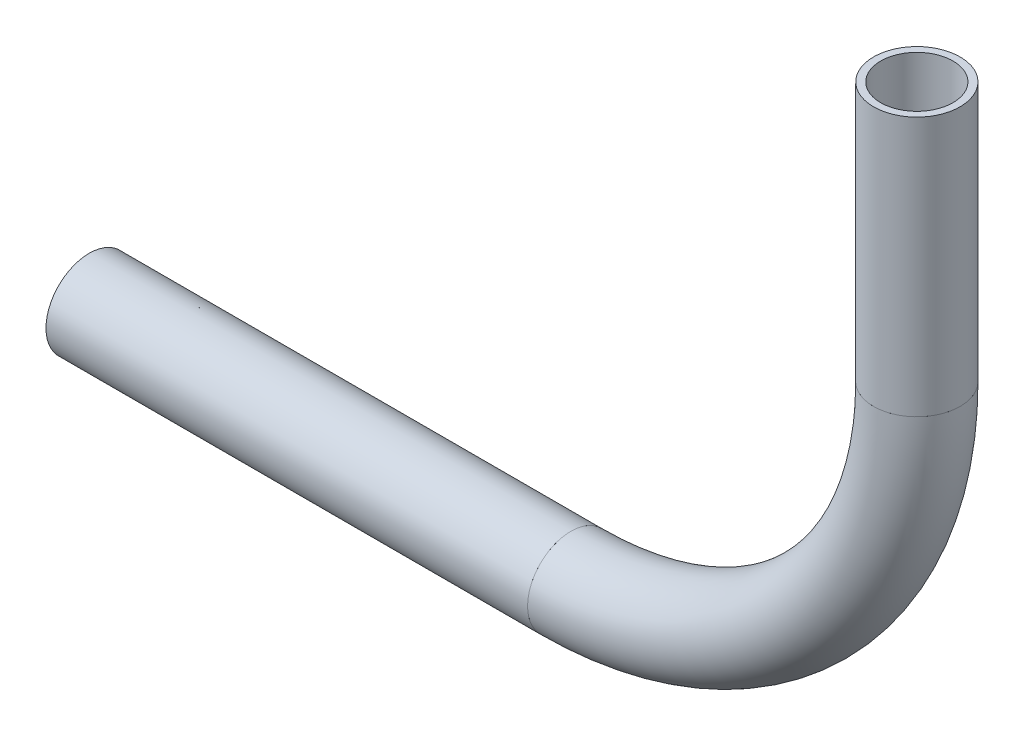
ISO-10303-21;
HEADER;
FILE_DESCRIPTION(('STEP AP214'),'2;1');
FILE_NAME('part.step','',(''),(''),'','','');
FILE_SCHEMA(('AUTOMOTIVE_DESIGN { 1 0 10303 214 1 1 1 1 }'));
ENDSEC;
DATA;
#1=APPLICATION_CONTEXT('core data for automotive mechanical design processes');
#2=APPLICATION_PROTOCOL_DEFINITION('international standard','automotive_design',2000,#1);
#3=PRODUCT_CONTEXT('',#1,'mechanical');
#4=PRODUCT('Part','Part','',(#3));
#5=PRODUCT_RELATED_PRODUCT_CATEGORY('part','',(#4));
#6=PRODUCT_DEFINITION_FORMATION('','',#4);
#7=PRODUCT_DEFINITION_CONTEXT('part definition',#1,'design');
#8=PRODUCT_DEFINITION('design','',#6,#7);
#9=PRODUCT_DEFINITION_SHAPE('','',#8);
#10=(LENGTH_UNIT() NAMED_UNIT(*) SI_UNIT(.MILLI.,.METRE.));
#11=(NAMED_UNIT(*) PLANE_ANGLE_UNIT() SI_UNIT($,.RADIAN.));
#12=(NAMED_UNIT(*) SI_UNIT($,.STERADIAN.) SOLID_ANGLE_UNIT());
#13=UNCERTAINTY_MEASURE_WITH_UNIT(LENGTH_MEASURE(1.E-05),#10,'distance_accuracy_value','');
#14=(GEOMETRIC_REPRESENTATION_CONTEXT(3) GLOBAL_UNCERTAINTY_ASSIGNED_CONTEXT((#13)) GLOBAL_UNIT_ASSIGNED_CONTEXT((#10,
#11,#12)) REPRESENTATION_CONTEXT('',''));
#15=CARTESIAN_POINT('',(0.,0.,0.));
#16=DIRECTION('',(0.,0.,1.));
#17=DIRECTION('',(1.,0.,0.));
#18=AXIS2_PLACEMENT_3D('',#15,#16,#17);
#19=CARTESIAN_POINT('',(-669.026852298777,-826.742936830069,0.));
#20=DIRECTION('',(0.,1.,0.));
#21=DIRECTION('',(0.,0.,1.));
#22=AXIS2_PLACEMENT_3D('',#19,#20,#21);
#23=CYLINDRICAL_SURFACE('',#22,5.30859999999999);
#24=CARTESIAN_POINT('',(-669.026852298777,-788.64293683007,0.));
#25=DIRECTION('',(0.,-1.,0.));
#26=DIRECTION('',(1.,0.,0.));
#27=AXIS2_PLACEMENT_3D('',#24,#25,#26);
#28=CIRCLE('',#27,5.30859999999999);
#29=CARTESIAN_POINT('',(-669.026852298777,-788.64293683007,5.30859999999999));
#30=VERTEX_POINT('',#29);
#31=EDGE_CURVE('E57',#30,#30,#28,.T.);
#32=CARTESIAN_POINT('',(-669.026852298777,-826.742936830069,0.));
#33=DIRECTION('',(0.,-1.,0.));
#34=DIRECTION('',(1.,0.,0.));
#35=AXIS2_PLACEMENT_3D('',#32,#33,#34);
#36=CIRCLE('',#35,5.30859999999999);
#37=CARTESIAN_POINT('',(-669.026852298777,-826.742936830069,5.30859999999999));
#38=VERTEX_POINT('',#37);
#39=EDGE_CURVE('E53',#38,#38,#36,.T.);
#40=CARTESIAN_POINT('',(-669.026852298777,-788.64293683007,5.30859999999999));
#41=CARTESIAN_POINT('',(-669.026852298777,-789.039811830069,5.30859999999999));
#42=CARTESIAN_POINT('',(-669.026852298777,-789.436686830069,5.30859999999999));
#43=CARTESIAN_POINT('',(-669.026852298777,-790.230436830069,5.30859999999999));
#44=CARTESIAN_POINT('',(-669.026852298777,-790.627311830069,5.30859999999999));
#45=CARTESIAN_POINT('',(-669.026852298777,-791.421061830069,5.30859999999999));
#46=CARTESIAN_POINT('',(-669.026852298777,-791.817936830069,5.30859999999999));
#47=CARTESIAN_POINT('',(-669.026852298777,-792.611686830069,5.30859999999999));
#48=CARTESIAN_POINT('',(-669.026852298777,-793.008561830069,5.30859999999999));
#49=CARTESIAN_POINT('',(-669.026852298777,-793.802311830069,5.30859999999999));
#50=CARTESIAN_POINT('',(-669.026852298777,-794.199186830069,5.30859999999999));
#51=CARTESIAN_POINT('',(-669.026852298777,-794.992936830069,5.30859999999999));
#52=CARTESIAN_POINT('',(-669.026852298777,-795.389811830069,5.30859999999999));
#53=CARTESIAN_POINT('',(-669.026852298777,-796.183561830069,5.30859999999999));
#54=CARTESIAN_POINT('',(-669.026852298777,-796.580436830069,5.30859999999999));
#55=CARTESIAN_POINT('',(-669.026852298777,-797.374186830069,5.30859999999999));
#56=CARTESIAN_POINT('',(-669.026852298777,-797.771061830069,5.30859999999999));
#57=CARTESIAN_POINT('',(-669.026852298777,-798.564811830069,5.30859999999999));
#58=CARTESIAN_POINT('',(-669.026852298777,-798.961686830069,5.30859999999999));
#59=CARTESIAN_POINT('',(-669.026852298777,-799.755436830069,5.30859999999999));
#60=CARTESIAN_POINT('',(-669.026852298777,-800.152311830069,5.30859999999999));
#61=CARTESIAN_POINT('',(-669.026852298777,-800.946061830069,5.30859999999999));
#62=CARTESIAN_POINT('',(-669.026852298777,-801.342936830069,5.30859999999999));
#63=CARTESIAN_POINT('',(-669.026852298777,-802.136686830069,5.30859999999999));
#64=CARTESIAN_POINT('',(-669.026852298777,-802.533561830069,5.30859999999999));
#65=CARTESIAN_POINT('',(-669.026852298777,-803.327311830069,5.30859999999999));
#66=CARTESIAN_POINT('',(-669.026852298777,-803.724186830069,5.30859999999999));
#67=CARTESIAN_POINT('',(-669.026852298777,-804.517936830069,5.30859999999999));
#68=CARTESIAN_POINT('',(-669.026852298777,-804.914811830069,5.30859999999999));
#69=CARTESIAN_POINT('',(-669.026852298777,-805.708561830069,5.30859999999999));
#70=CARTESIAN_POINT('',(-669.026852298777,-806.105436830069,5.30859999999999));
#71=CARTESIAN_POINT('',(-669.026852298777,-806.899186830069,5.30859999999999));
#72=CARTESIAN_POINT('',(-669.026852298777,-807.296061830069,5.30859999999999));
#73=CARTESIAN_POINT('',(-669.026852298777,-808.089811830069,5.30859999999999));
#74=CARTESIAN_POINT('',(-669.026852298777,-808.486686830069,5.30859999999999));
#75=CARTESIAN_POINT('',(-669.026852298777,-809.280436830069,5.30859999999999));
#76=CARTESIAN_POINT('',(-669.026852298777,-809.677311830069,5.30859999999999));
#77=CARTESIAN_POINT('',(-669.026852298777,-810.471061830069,5.30859999999999));
#78=CARTESIAN_POINT('',(-669.026852298777,-810.867936830069,5.30859999999999));
#79=CARTESIAN_POINT('',(-669.026852298777,-811.661686830069,5.30859999999999));
#80=CARTESIAN_POINT('',(-669.026852298777,-812.058561830069,5.30859999999999));
#81=CARTESIAN_POINT('',(-669.026852298777,-812.852311830069,5.30859999999999));
#82=CARTESIAN_POINT('',(-669.026852298777,-813.249186830069,5.30859999999999));
#83=CARTESIAN_POINT('',(-669.026852298777,-814.042936830069,5.30859999999999));
#84=CARTESIAN_POINT('',(-669.026852298777,-814.439811830069,5.30859999999999));
#85=CARTESIAN_POINT('',(-669.026852298777,-815.233561830069,5.30859999999999));
#86=CARTESIAN_POINT('',(-669.026852298777,-815.630436830069,5.30859999999999));
#87=CARTESIAN_POINT('',(-669.026852298777,-816.424186830069,5.30859999999999));
#88=CARTESIAN_POINT('',(-669.026852298777,-816.821061830069,5.30859999999999));
#89=CARTESIAN_POINT('',(-669.026852298777,-817.614811830069,5.30859999999999));
#90=CARTESIAN_POINT('',(-669.026852298777,-818.011686830069,5.30859999999999));
#91=CARTESIAN_POINT('',(-669.026852298777,-818.805436830069,5.30859999999999));
#92=CARTESIAN_POINT('',(-669.026852298777,-819.202311830069,5.30859999999999));
#93=CARTESIAN_POINT('',(-669.026852298777,-819.996061830069,5.30859999999999));
#94=CARTESIAN_POINT('',(-669.026852298777,-820.392936830069,5.30859999999999));
#95=CARTESIAN_POINT('',(-669.026852298777,-821.186686830069,5.30859999999999));
#96=CARTESIAN_POINT('',(-669.026852298777,-821.583561830069,5.30859999999999));
#97=CARTESIAN_POINT('',(-669.026852298777,-822.377311830069,5.30859999999999));
#98=CARTESIAN_POINT('',(-669.026852298777,-822.774186830069,5.30859999999999));
#99=CARTESIAN_POINT('',(-669.026852298777,-823.567936830069,5.30859999999999));
#100=CARTESIAN_POINT('',(-669.026852298777,-823.964811830069,5.30859999999999));
#101=CARTESIAN_POINT('',(-669.026852298777,-824.758561830069,5.30859999999999));
#102=CARTESIAN_POINT('',(-669.026852298777,-825.155436830069,5.30859999999999));
#103=CARTESIAN_POINT('',(-669.026852298777,-825.949186830069,5.30859999999999));
#104=CARTESIAN_POINT('',(-669.026852298777,-826.346061830069,5.30859999999999));
#105=CARTESIAN_POINT('',(-669.026852298777,-826.742936830069,5.30859999999999));
#106=B_SPLINE_CURVE_WITH_KNOTS('',3,(#40,#41,#42,#43,#44,#45,#46,#47,#48,#49,#50,#51,#52,#53,
#54,#55,#56,#57,#58,#59,#60,#61,#62,#63,#64,#65,#66,#67,#68,#69,#70,#71,#72,#73,#74,#75,#76,#77,
#78,#79,#80,#81,#82,#83,#84,#85,#86,#87,#88,#89,#90,#91,#92,#93,#94,#95,#96,#97,#98,#99,#100,
#101,#102,#103,#104,#105),.UNSPECIFIED.,.F.,.F.,(4,2,2,2,2,2,2,2,2,2,2,2,2,2,2,2,2,2,2,2,2,2,2,
2,2,2,2,2,2,2,2,2,4),(0.,1.19062499999989,2.38124999999989,3.57187499999989,4.76249999999989,
5.95312499999989,7.14374999999989,8.33437499999989,9.5249999999999,10.7156249999998,
11.9062499999998,13.0968749999998,14.2874999999998,15.4781249999998,16.6687499999998,
17.8593749999998,19.0499999999998,20.2406249999997,21.4312499999997,22.6218749999997,
23.8124999999997,25.0031249999997,26.1937499999997,27.3843749999997,28.5749999999997,
29.7656249999996,30.9562499999996,32.1468749999996,33.3374999999996,34.5281249999996,
35.7187499999996,36.9093749999996,38.0999999999996),.UNSPECIFIED.);
#107=EDGE_CURVE('BSEAM49',#30,#38,#106,.T.);
#108=ORIENTED_EDGE('',*,*,#31,.F.);
#109=ORIENTED_EDGE('',*,*,#39,.T.);
#110=ORIENTED_EDGE('',*,*,#107,.T.);
#111=ORIENTED_EDGE('',*,*,#107,.F.);
#112=EDGE_LOOP('',(#108,#110,#109,#111));
#113=FACE_BOUND('',#112,.T.);
#114=ADVANCED_FACE('F49',(#113),#23,.F.);
#115=CARTESIAN_POINT('',(-669.026852298777,-826.742936830069,0.));
#116=DIRECTION('',(0.,1.,0.));
#117=DIRECTION('',(0.,0.,1.));
#118=AXIS2_PLACEMENT_3D('',#115,#116,#117);
#119=CYLINDRICAL_SURFACE('',#118,6.35000000000005);
#120=CARTESIAN_POINT('',(-669.026852298777,-788.64293683007,0.));
#121=DIRECTION('',(0.,-1.,0.));
#122=DIRECTION('',(1.,0.,0.));
#123=AXIS2_PLACEMENT_3D('',#120,#121,#122);
#124=CIRCLE('',#123,6.35000000000005);
#125=CARTESIAN_POINT('',(-669.026852298777,-788.64293683007,6.35000000000005));
#126=VERTEX_POINT('',#125);
#127=EDGE_CURVE('E61',#126,#126,#124,.T.);
#128=CARTESIAN_POINT('',(-669.026852298777,-826.742936830069,0.));
#129=DIRECTION('',(0.,-1.,0.));
#130=DIRECTION('',(1.,0.,0.));
#131=AXIS2_PLACEMENT_3D('',#128,#129,#130);
#132=CIRCLE('',#131,6.35000000000005);
#133=CARTESIAN_POINT('',(-669.026852298777,-826.742936830069,6.35000000000005));
#134=VERTEX_POINT('',#133);
#135=EDGE_CURVE('E12',#134,#134,#132,.T.);
#136=CARTESIAN_POINT('',(-669.026852298777,-788.64293683007,6.35000000000005));
#137=CARTESIAN_POINT('',(-669.026852298777,-789.039811830069,6.35000000000005));
#138=CARTESIAN_POINT('',(-669.026852298777,-789.436686830069,6.35000000000005));
#139=CARTESIAN_POINT('',(-669.026852298777,-790.230436830069,6.35000000000005));
#140=CARTESIAN_POINT('',(-669.026852298777,-790.627311830069,6.35000000000005));
#141=CARTESIAN_POINT('',(-669.026852298777,-791.421061830069,6.35000000000005));
#142=CARTESIAN_POINT('',(-669.026852298777,-791.817936830069,6.35000000000005));
#143=CARTESIAN_POINT('',(-669.026852298777,-792.611686830069,6.35000000000005));
#144=CARTESIAN_POINT('',(-669.026852298777,-793.008561830069,6.35000000000005));
#145=CARTESIAN_POINT('',(-669.026852298777,-793.802311830069,6.35000000000005));
#146=CARTESIAN_POINT('',(-669.026852298777,-794.199186830069,6.35000000000005));
#147=CARTESIAN_POINT('',(-669.026852298777,-794.992936830069,6.35000000000005));
#148=CARTESIAN_POINT('',(-669.026852298777,-795.389811830069,6.35000000000005));
#149=CARTESIAN_POINT('',(-669.026852298777,-796.183561830069,6.35000000000005));
#150=CARTESIAN_POINT('',(-669.026852298777,-796.580436830069,6.35000000000005));
#151=CARTESIAN_POINT('',(-669.026852298777,-797.374186830069,6.35000000000005));
#152=CARTESIAN_POINT('',(-669.026852298777,-797.771061830069,6.35000000000005));
#153=CARTESIAN_POINT('',(-669.026852298777,-798.564811830069,6.35000000000005));
#154=CARTESIAN_POINT('',(-669.026852298777,-798.961686830069,6.35000000000005));
#155=CARTESIAN_POINT('',(-669.026852298777,-799.755436830069,6.35000000000005));
#156=CARTESIAN_POINT('',(-669.026852298777,-800.152311830069,6.35000000000005));
#157=CARTESIAN_POINT('',(-669.026852298777,-800.946061830069,6.35000000000005));
#158=CARTESIAN_POINT('',(-669.026852298777,-801.342936830069,6.35000000000005));
#159=CARTESIAN_POINT('',(-669.026852298777,-802.136686830069,6.35000000000005));
#160=CARTESIAN_POINT('',(-669.026852298777,-802.533561830069,6.35000000000005));
#161=CARTESIAN_POINT('',(-669.026852298777,-803.327311830069,6.35000000000005));
#162=CARTESIAN_POINT('',(-669.026852298777,-803.724186830069,6.35000000000005));
#163=CARTESIAN_POINT('',(-669.026852298777,-804.517936830069,6.35000000000005));
#164=CARTESIAN_POINT('',(-669.026852298777,-804.914811830069,6.35000000000005));
#165=CARTESIAN_POINT('',(-669.026852298777,-805.708561830069,6.35000000000005));
#166=CARTESIAN_POINT('',(-669.026852298777,-806.105436830069,6.35000000000005));
#167=CARTESIAN_POINT('',(-669.026852298777,-806.899186830069,6.35000000000005));
#168=CARTESIAN_POINT('',(-669.026852298777,-807.296061830069,6.35000000000005));
#169=CARTESIAN_POINT('',(-669.026852298777,-808.089811830069,6.35000000000005));
#170=CARTESIAN_POINT('',(-669.026852298777,-808.486686830069,6.35000000000005));
#171=CARTESIAN_POINT('',(-669.026852298777,-809.280436830069,6.35000000000005));
#172=CARTESIAN_POINT('',(-669.026852298777,-809.677311830069,6.35000000000005));
#173=CARTESIAN_POINT('',(-669.026852298777,-810.471061830069,6.35000000000005));
#174=CARTESIAN_POINT('',(-669.026852298777,-810.867936830069,6.35000000000005));
#175=CARTESIAN_POINT('',(-669.026852298777,-811.661686830069,6.35000000000005));
#176=CARTESIAN_POINT('',(-669.026852298777,-812.058561830069,6.35000000000005));
#177=CARTESIAN_POINT('',(-669.026852298777,-812.852311830069,6.35000000000005));
#178=CARTESIAN_POINT('',(-669.026852298777,-813.249186830069,6.35000000000005));
#179=CARTESIAN_POINT('',(-669.026852298777,-814.042936830069,6.35000000000005));
#180=CARTESIAN_POINT('',(-669.026852298777,-814.439811830069,6.35000000000005));
#181=CARTESIAN_POINT('',(-669.026852298777,-815.233561830069,6.35000000000005));
#182=CARTESIAN_POINT('',(-669.026852298777,-815.630436830069,6.35000000000005));
#183=CARTESIAN_POINT('',(-669.026852298777,-816.424186830069,6.35000000000005));
#184=CARTESIAN_POINT('',(-669.026852298777,-816.821061830069,6.35000000000005));
#185=CARTESIAN_POINT('',(-669.026852298777,-817.614811830069,6.35000000000005));
#186=CARTESIAN_POINT('',(-669.026852298777,-818.011686830069,6.35000000000005));
#187=CARTESIAN_POINT('',(-669.026852298777,-818.805436830069,6.35000000000005));
#188=CARTESIAN_POINT('',(-669.026852298777,-819.202311830069,6.35000000000005));
#189=CARTESIAN_POINT('',(-669.026852298777,-819.996061830069,6.35000000000005));
#190=CARTESIAN_POINT('',(-669.026852298777,-820.392936830069,6.35000000000005));
#191=CARTESIAN_POINT('',(-669.026852298777,-821.186686830069,6.35000000000005));
#192=CARTESIAN_POINT('',(-669.026852298777,-821.583561830069,6.35000000000005));
#193=CARTESIAN_POINT('',(-669.026852298777,-822.377311830069,6.35000000000005));
#194=CARTESIAN_POINT('',(-669.026852298777,-822.774186830069,6.35000000000005));
#195=CARTESIAN_POINT('',(-669.026852298777,-823.567936830069,6.35000000000005));
#196=CARTESIAN_POINT('',(-669.026852298777,-823.964811830069,6.35000000000005));
#197=CARTESIAN_POINT('',(-669.026852298777,-824.758561830069,6.35000000000005));
#198=CARTESIAN_POINT('',(-669.026852298777,-825.155436830069,6.35000000000005));
#199=CARTESIAN_POINT('',(-669.026852298777,-825.949186830069,6.35000000000005));
#200=CARTESIAN_POINT('',(-669.026852298777,-826.346061830069,6.35000000000005));
#201=CARTESIAN_POINT('',(-669.026852298777,-826.742936830069,6.35000000000005));
#202=B_SPLINE_CURVE_WITH_KNOTS('',3,(#136,#137,#138,#139,#140,#141,#142,#143,#144,#145,#146,
#147,#148,#149,#150,#151,#152,#153,#154,#155,#156,#157,#158,#159,#160,#161,#162,#163,#164,#165,
#166,#167,#168,#169,#170,#171,#172,#173,#174,#175,#176,#177,#178,#179,#180,#181,#182,#183,#184,
#185,#186,#187,#188,#189,#190,#191,#192,#193,#194,#195,#196,#197,#198,#199,#200,#201),
.UNSPECIFIED.,.F.,.F.,(4,2,2,2,2,2,2,2,2,2,2,2,2,2,2,2,2,2,2,2,2,2,2,2,2,2,2,2,2,2,2,2,4),(0.,
1.19062499999989,2.38124999999989,3.57187499999989,4.76249999999989,5.95312499999989,
7.14374999999989,8.33437499999989,9.5249999999999,10.7156249999998,11.9062499999998,
13.0968749999998,14.2874999999998,15.4781249999998,16.6687499999998,17.8593749999998,
19.0499999999998,20.2406249999997,21.4312499999997,22.6218749999997,23.8124999999997,
25.0031249999997,26.1937499999997,27.3843749999997,28.5749999999997,29.7656249999996,
30.9562499999996,32.1468749999996,33.3374999999996,34.5281249999996,35.7187499999996,
36.9093749999996,38.0999999999996),.UNSPECIFIED.);
#203=EDGE_CURVE('BSEAM76',#126,#134,#202,.T.);
#204=ORIENTED_EDGE('',*,*,#127,.T.);
#205=ORIENTED_EDGE('',*,*,#135,.F.);
#206=ORIENTED_EDGE('',*,*,#203,.T.);
#207=ORIENTED_EDGE('',*,*,#203,.F.);
#208=EDGE_LOOP('',(#204,#206,#205,#207));
#209=FACE_BOUND('',#208,.T.);
#210=ADVANCED_FACE('F76',(#209),#119,.T.);
#211=CARTESIAN_POINT('',(-669.026852298777,-788.64293683007,0.));
#212=DIRECTION('',(0.,-1.,0.));
#213=DIRECTION('',(1.,0.,0.));
#214=AXIS2_PLACEMENT_3D('',#211,#212,#213);
#215=PLANE('',#214);
#216=ORIENTED_EDGE('',*,*,#31,.T.);
#217=EDGE_LOOP('',(#216));
#218=FACE_BOUND('',#217,.T.);
#219=ORIENTED_EDGE('',*,*,#127,.F.);
#220=EDGE_LOOP('',(#219));
#221=FACE_BOUND('',#220,.T.);
#222=ADVANCED_FACE('F72',(#218,#221),#215,.F.);
#223=CARTESIAN_POINT('',(-669.026852298777,-826.742936830069,0.));
#224=DIRECTION('',(0.,-1.,0.));
#225=DIRECTION('',(1.,0.,0.));
#226=AXIS2_PLACEMENT_3D('',#223,#224,#225);
#227=PLANE('',#226);
#228=ORIENTED_EDGE('',*,*,#39,.F.);
#229=EDGE_LOOP('',(#228));
#230=FACE_BOUND('',#229,.T.);
#231=ORIENTED_EDGE('',*,*,#135,.T.);
#232=EDGE_LOOP('',(#231));
#233=FACE_BOUND('',#232,.T.);
#234=ADVANCED_FACE('F51',(#230,#233),#227,.T.);
#235=CLOSED_SHELL('',(#114,#210,#222,#234));
#236=MANIFOLD_SOLID_BREP('B2',#235);
#237=CARTESIAN_POINT('',(-719.826852298777,-826.74293683007,0.));
#238=DIRECTION('',(0.,0.,1.));
#239=DIRECTION('',(1.,0.,0.));
#240=AXIS2_PLACEMENT_3D('',#237,#238,#239);
#241=TOROIDAL_SURFACE('',#240,50.8000000000001,5.30859999999999);
#242=CARTESIAN_POINT('',(-719.826852298777,-877.54293683007,0.));
#243=DIRECTION('',(-1.,0.,0.));
#244=DIRECTION('',(0.,-1.,0.));
#245=AXIS2_PLACEMENT_3D('',#242,#243,#244);
#246=CIRCLE('',#245,5.30859999999999);
#247=CARTESIAN_POINT('',(-719.826852298777,-882.85153683007,0.));
#248=VERTEX_POINT('',#247);
#249=EDGE_CURVE('E152',#248,#248,#246,.T.);
#250=CARTESIAN_POINT('',(-669.026852298777,-826.742936830069,0.));
#251=DIRECTION('',(0.,1.,0.));
#252=DIRECTION('',(-1.,0.,0.));
#253=AXIS2_PLACEMENT_3D('',#250,#251,#252);
#254=CIRCLE('',#253,5.30859999999999);
#255=CARTESIAN_POINT('',(-663.718252298777,-826.742936830069,0.));
#256=VERTEX_POINT('',#255);
#257=EDGE_CURVE('E142',#256,#256,#254,.T.);
#258=CARTESIAN_POINT('',(-719.826852298777,-826.74293683007,0.));
#259=DIRECTION('',(0.,0.,1.));
#260=DIRECTION('',(1.,0.,0.));
#261=AXIS2_PLACEMENT_3D('',#258,#259,#260);
#262=CIRCLE('',#261,56.1086000000001);
#263=EDGE_CURVE('',#248,#256,#262,.T.);
#264=ORIENTED_EDGE('',*,*,#249,.T.);
#265=ORIENTED_EDGE('',*,*,#257,.T.);
#266=ORIENTED_EDGE('',*,*,#263,.T.);
#267=ORIENTED_EDGE('',*,*,#263,.F.);
#268=EDGE_LOOP('',(#264,#266,#265,#267));
#269=FACE_BOUND('',#268,.T.);
#270=ADVANCED_FACE('F138',(#269),#241,.F.);
#271=CARTESIAN_POINT('',(-719.826852298777,-826.74293683007,0.));
#272=DIRECTION('',(0.,0.,1.));
#273=DIRECTION('',(1.,0.,0.));
#274=AXIS2_PLACEMENT_3D('',#271,#272,#273);
#275=TOROIDAL_SURFACE('',#274,50.8000000000001,6.35000000000005);
#276=CARTESIAN_POINT('',(-719.826852298777,-877.54293683007,0.));
#277=DIRECTION('',(-1.,0.,0.));
#278=DIRECTION('',(0.,-1.,0.));
#279=AXIS2_PLACEMENT_3D('',#276,#277,#278);
#280=CIRCLE('',#279,6.35000000000005);
#281=CARTESIAN_POINT('',(-719.826852298778,-883.89293683007,0.));
#282=VERTEX_POINT('',#281);
#283=EDGE_CURVE('E146',#282,#282,#280,.T.);
#284=CARTESIAN_POINT('',(-669.026852298777,-826.742936830069,0.));
#285=DIRECTION('',(0.,1.,0.));
#286=DIRECTION('',(-1.,0.,0.));
#287=AXIS2_PLACEMENT_3D('',#284,#285,#286);
#288=CIRCLE('',#287,6.35000000000005);
#289=CARTESIAN_POINT('',(-662.676852298777,-826.742936830069,0.));
#290=VERTEX_POINT('',#289);
#291=EDGE_CURVE('E48',#290,#290,#288,.T.);
#292=CARTESIAN_POINT('',(-719.826852298777,-826.74293683007,0.));
#293=DIRECTION('',(0.,0.,1.));
#294=DIRECTION('',(1.,0.,0.));
#295=AXIS2_PLACEMENT_3D('',#292,#293,#294);
#296=CIRCLE('',#295,57.1500000000001);
#297=EDGE_CURVE('',#282,#290,#296,.T.);
#298=ORIENTED_EDGE('',*,*,#283,.F.);
#299=ORIENTED_EDGE('',*,*,#291,.F.);
#300=ORIENTED_EDGE('',*,*,#297,.T.);
#301=ORIENTED_EDGE('',*,*,#297,.F.);
#302=EDGE_LOOP('',(#298,#300,#299,#301));
#303=FACE_BOUND('',#302,.T.);
#304=ADVANCED_FACE('F165',(#303),#275,.T.);
#305=CARTESIAN_POINT('',(-719.826852298777,-877.542936830069,0.));
#306=DIRECTION('',(-1.,0.,0.));
#307=DIRECTION('',(0.,-1.,0.));
#308=AXIS2_PLACEMENT_3D('',#305,#306,#307);
#309=PLANE('',#308);
#310=ORIENTED_EDGE('',*,*,#249,.F.);
#311=EDGE_LOOP('',(#310));
#312=FACE_BOUND('',#311,.T.);
#313=ORIENTED_EDGE('',*,*,#283,.T.);
#314=EDGE_LOOP('',(#313));
#315=FACE_BOUND('',#314,.T.);
#316=ADVANCED_FACE('F161',(#312,#315),#309,.T.);
#317=CARTESIAN_POINT('',(-669.026852298777,-826.742936830069,0.));
#318=DIRECTION('',(0.,1.,0.));
#319=DIRECTION('',(-1.,0.,0.));
#320=AXIS2_PLACEMENT_3D('',#317,#318,#319);
#321=PLANE('',#320);
#322=ORIENTED_EDGE('',*,*,#257,.F.);
#323=EDGE_LOOP('',(#322));
#324=FACE_BOUND('',#323,.T.);
#325=ORIENTED_EDGE('',*,*,#291,.T.);
#326=EDGE_LOOP('',(#325));
#327=FACE_BOUND('',#326,.T.);
#328=ADVANCED_FACE('F140',(#324,#327),#321,.T.);
#329=CLOSED_SHELL('',(#270,#304,#316,#328));
#330=MANIFOLD_SOLID_BREP('B7',#329);
#331=CARTESIAN_POINT('',(-790.537314415488,-877.54293683007,0.));
#332=DIRECTION('',(1.,0.,0.));
#333=DIRECTION('',(0.,0.,-1.));
#334=AXIS2_PLACEMENT_3D('',#331,#332,#333);
#335=CYLINDRICAL_SURFACE('',#334,5.30859999999999);
#336=CARTESIAN_POINT('',(-790.537314415488,-877.54293683007,0.));
#337=DIRECTION('',(-1.,0.,0.));
#338=DIRECTION('',(0.,-1.,0.));
#339=AXIS2_PLACEMENT_3D('',#336,#337,#338);
#340=CIRCLE('',#339,5.30859999999999);
#341=CARTESIAN_POINT('',(-790.537314415488,-882.85153683007,0.));
#342=VERTEX_POINT('',#341);
#343=EDGE_CURVE('E236',#342,#342,#340,.T.);
#344=ORIENTED_EDGE('',*,*,#343,.T.);
#345=EDGE_LOOP('',(#344));
#346=FACE_BOUND('',#345,.T.);
#347=CARTESIAN_POINT('',(-719.826852298777,-877.54293683007,0.));
#348=DIRECTION('',(1.,0.,0.));
#349=DIRECTION('',(0.,1.,0.));
#350=AXIS2_PLACEMENT_3D('',#347,#348,#349);
#351=CIRCLE('',#350,5.30859999999999);
#352=CARTESIAN_POINT('',(-719.826852298777,-872.23433683007,0.));
#353=VERTEX_POINT('',#352);
#354=EDGE_CURVE('E226',#353,#353,#351,.T.);
#355=ORIENTED_EDGE('',*,*,#354,.T.);
#356=EDGE_LOOP('',(#355));
#357=FACE_BOUND('',#356,.T.);
#358=ADVANCED_FACE('F222',(#346,#357),#335,.F.);
#359=CARTESIAN_POINT('',(-790.537314415488,-877.54293683007,0.));
#360=DIRECTION('',(1.,0.,0.));
#361=DIRECTION('',(0.,0.,-1.));
#362=AXIS2_PLACEMENT_3D('',#359,#360,#361);
#363=CYLINDRICAL_SURFACE('',#362,6.35000000000005);
#364=CARTESIAN_POINT('',(-790.537314415488,-877.54293683007,0.));
#365=DIRECTION('',(-1.,0.,0.));
#366=DIRECTION('',(0.,-1.,0.));
#367=AXIS2_PLACEMENT_3D('',#364,#365,#366);
#368=CIRCLE('',#367,6.35000000000005);
#369=CARTESIAN_POINT('',(-790.537314415488,-883.89293683007,0.));
#370=VERTEX_POINT('',#369);
#371=EDGE_CURVE('E230',#370,#370,#368,.T.);
#372=ORIENTED_EDGE('',*,*,#371,.F.);
#373=EDGE_LOOP('',(#372));
#374=FACE_BOUND('',#373,.T.);
#375=CARTESIAN_POINT('',(-719.826852298777,-877.54293683007,0.));
#376=DIRECTION('',(1.,0.,0.));
#377=DIRECTION('',(0.,1.,0.));
#378=AXIS2_PLACEMENT_3D('',#375,#376,#377);
#379=CIRCLE('',#378,6.35000000000005);
#380=CARTESIAN_POINT('',(-719.826852298777,-871.192936830069,0.));
#381=VERTEX_POINT('',#380);
#382=EDGE_CURVE('E137',#381,#381,#379,.T.);
#383=ORIENTED_EDGE('',*,*,#382,.F.);
#384=EDGE_LOOP('',(#383));
#385=FACE_BOUND('',#384,.T.);
#386=ADVANCED_FACE('F249',(#374,#385),#363,.T.);
#387=CARTESIAN_POINT('',(-790.537314415488,-877.54293683007,0.));
#388=DIRECTION('',(-1.,0.,0.));
#389=DIRECTION('',(0.,-1.,0.));
#390=AXIS2_PLACEMENT_3D('',#387,#388,#389);
#391=PLANE('',#390);
#392=ORIENTED_EDGE('',*,*,#343,.F.);
#393=EDGE_LOOP('',(#392));
#394=FACE_BOUND('',#393,.T.);
#395=ORIENTED_EDGE('',*,*,#371,.T.);
#396=EDGE_LOOP('',(#395));
#397=FACE_BOUND('',#396,.T.);
#398=ADVANCED_FACE('F245',(#394,#397),#391,.T.);
#399=CARTESIAN_POINT('',(-719.826852298777,-877.542936830069,0.));
#400=DIRECTION('',(1.,0.,0.));
#401=DIRECTION('',(0.,1.,0.));
#402=AXIS2_PLACEMENT_3D('',#399,#400,#401);
#403=PLANE('',#402);
#404=ORIENTED_EDGE('',*,*,#354,.F.);
#405=EDGE_LOOP('',(#404));
#406=FACE_BOUND('',#405,.T.);
#407=ORIENTED_EDGE('',*,*,#382,.T.);
#408=EDGE_LOOP('',(#407));
#409=FACE_BOUND('',#408,.T.);
#410=ADVANCED_FACE('F224',(#406,#409),#403,.T.);
#411=CLOSED_SHELL('',(#358,#386,#398,#410));
#412=MANIFOLD_SOLID_BREP('B43',#411);
#413=ADVANCED_BREP_SHAPE_REPRESENTATION('',(#18,#236,#330,#412),#14);
#414=SHAPE_DEFINITION_REPRESENTATION(#9,#413);
ENDSEC;
END-ISO-10303-21;
